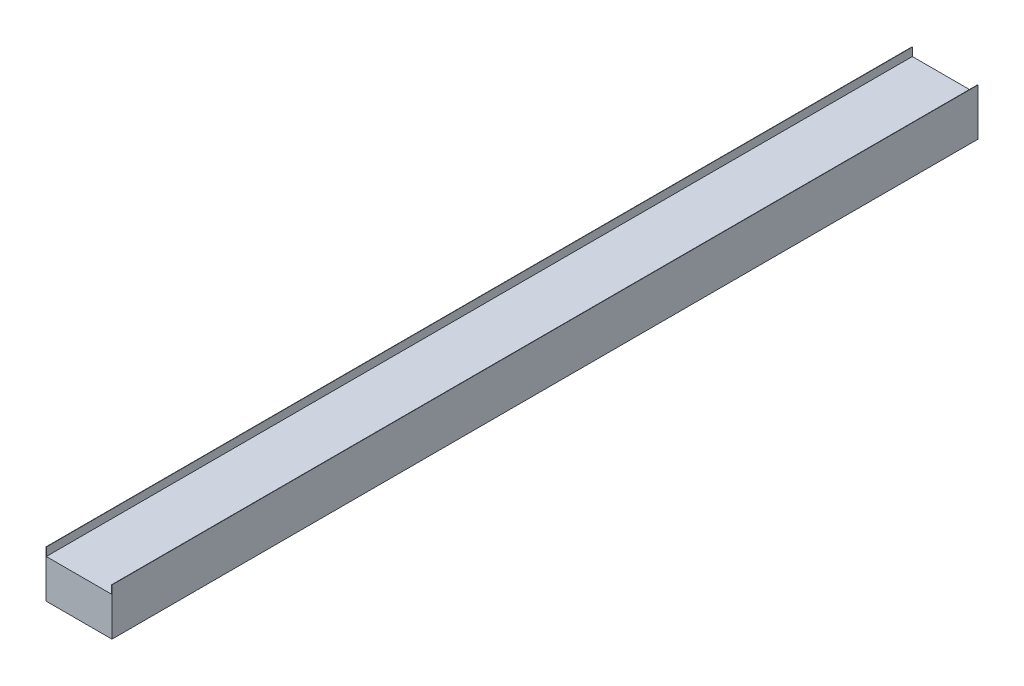
ISO-10303-21;
HEADER;
FILE_DESCRIPTION(('STEP AP214'),'2;1');
FILE_NAME('part.step','',(''),(''),'','','');
FILE_SCHEMA(('AUTOMOTIVE_DESIGN { 1 0 10303 214 1 1 1 1 }'));
ENDSEC;
DATA;
#1=APPLICATION_CONTEXT('core data for automotive mechanical design processes');
#2=APPLICATION_PROTOCOL_DEFINITION('international standard','automotive_design',2000,#1);
#3=PRODUCT_CONTEXT('',#1,'mechanical');
#4=PRODUCT('Part','Part','',(#3));
#5=PRODUCT_RELATED_PRODUCT_CATEGORY('part','',(#4));
#6=PRODUCT_DEFINITION_FORMATION('','',#4);
#7=PRODUCT_DEFINITION_CONTEXT('part definition',#1,'design');
#8=PRODUCT_DEFINITION('design','',#6,#7);
#9=PRODUCT_DEFINITION_SHAPE('','',#8);
#10=(LENGTH_UNIT() NAMED_UNIT(*) SI_UNIT(.MILLI.,.METRE.));
#11=(NAMED_UNIT(*) PLANE_ANGLE_UNIT() SI_UNIT($,.RADIAN.));
#12=(NAMED_UNIT(*) SI_UNIT($,.STERADIAN.) SOLID_ANGLE_UNIT());
#13=UNCERTAINTY_MEASURE_WITH_UNIT(LENGTH_MEASURE(1.E-05),#10,'distance_accuracy_value','');
#14=(GEOMETRIC_REPRESENTATION_CONTEXT(3) GLOBAL_UNCERTAINTY_ASSIGNED_CONTEXT((#13)) GLOBAL_UNIT_ASSIGNED_CONTEXT((#10,
#11,#12)) REPRESENTATION_CONTEXT('',''));
#15=CARTESIAN_POINT('',(0.,0.,0.));
#16=DIRECTION('',(0.,0.,1.));
#17=DIRECTION('',(1.,0.,0.));
#18=AXIS2_PLACEMENT_3D('',#15,#16,#17);
#19=CARTESIAN_POINT('',(0.,0.,10500.));
#20=DIRECTION('',(1.,0.,0.));
#21=DIRECTION('',(0.,1.,0.));
#22=AXIS2_PLACEMENT_3D('',#19,#20,#21);
#23=PLANE('',#22);
#24=DIRECTION('',(0.,-1.,0.));
#25=VECTOR('',#24,1.);
#26=CARTESIAN_POINT('',(0.,0.,0.));
#27=LINE('',#26,#25);
#28=CARTESIAN_POINT('',(0.,0.,0.));
#29=VERTEX_POINT('',#28);
#30=CARTESIAN_POINT('',(0.,-570.,0.));
#31=VERTEX_POINT('',#30);
#32=EDGE_CURVE('E132',#29,#31,#27,.T.);
#33=ORIENTED_EDGE('',*,*,#32,.T.);
#34=DIRECTION('',(0.,0.,-1.));
#35=VECTOR('',#34,1.);
#36=CARTESIAN_POINT('',(0.,-570.,10500.));
#37=LINE('',#36,#35);
#38=CARTESIAN_POINT('',(0.,-570.,10500.));
#39=VERTEX_POINT('',#38);
#40=EDGE_CURVE('E11',#39,#31,#37,.T.);
#41=ORIENTED_EDGE('',*,*,#40,.F.);
#42=DIRECTION('',(0.,-1.,0.));
#43=VECTOR('',#42,1.);
#44=CARTESIAN_POINT('',(0.,0.,10500.));
#45=LINE('',#44,#43);
#46=CARTESIAN_POINT('',(0.,0.,10500.));
#47=VERTEX_POINT('',#46);
#48=EDGE_CURVE('E146',#47,#39,#45,.T.);
#49=ORIENTED_EDGE('',*,*,#48,.F.);
#50=DIRECTION('',(0.,0.,-1.));
#51=VECTOR('',#50,1.);
#52=CARTESIAN_POINT('',(0.,0.,10500.));
#53=LINE('',#52,#51);
#54=EDGE_CURVE('E128',#47,#29,#53,.T.);
#55=ORIENTED_EDGE('',*,*,#54,.T.);
#56=EDGE_LOOP('',(#33,#41,#49,#55));
#57=FACE_BOUND('',#56,.T.);
#58=ADVANCED_FACE('F36',(#57),#23,.F.);
#59=CARTESIAN_POINT('',(0.,-570.,10500.));
#60=DIRECTION('',(0.,1.,0.));
#61=DIRECTION('',(0.,0.,1.));
#62=AXIS2_PLACEMENT_3D('',#59,#60,#61);
#63=PLANE('',#62);
#64=DIRECTION('',(1.,0.,0.));
#65=VECTOR('',#64,1.);
#66=CARTESIAN_POINT('',(0.,-570.,0.));
#67=LINE('',#66,#65);
#68=CARTESIAN_POINT('',(800.,-570.,0.));
#69=VERTEX_POINT('',#68);
#70=EDGE_CURVE('E135',#31,#69,#67,.T.);
#71=ORIENTED_EDGE('',*,*,#70,.T.);
#72=DIRECTION('',(0.,0.,-1.));
#73=VECTOR('',#72,1.);
#74=CARTESIAN_POINT('',(800.,-570.,10500.));
#75=LINE('',#74,#73);
#76=CARTESIAN_POINT('',(800.,-570.,10500.));
#77=VERTEX_POINT('',#76);
#78=EDGE_CURVE('E44',#77,#69,#75,.T.);
#79=ORIENTED_EDGE('',*,*,#78,.F.);
#80=DIRECTION('',(1.,0.,0.));
#81=VECTOR('',#80,1.);
#82=CARTESIAN_POINT('',(0.,-570.,10500.));
#83=LINE('',#82,#81);
#84=EDGE_CURVE('E95',#39,#77,#83,.T.);
#85=ORIENTED_EDGE('',*,*,#84,.F.);
#86=ORIENTED_EDGE('',*,*,#40,.T.);
#87=EDGE_LOOP('',(#71,#79,#85,#86));
#88=FACE_BOUND('',#87,.T.);
#89=ADVANCED_FACE('F181',(#88),#63,.F.);
#90=CARTESIAN_POINT('',(800.,0.,10500.));
#91=DIRECTION('',(-1.,0.,0.));
#92=DIRECTION('',(0.,-1.,0.));
#93=AXIS2_PLACEMENT_3D('',#90,#91,#92);
#94=PLANE('',#93);
#95=DIRECTION('',(0.,1.,0.));
#96=VECTOR('',#95,1.);
#97=CARTESIAN_POINT('',(800.,0.,0.));
#98=LINE('',#97,#96);
#99=CARTESIAN_POINT('',(800.,0.,0.));
#100=VERTEX_POINT('',#99);
#101=EDGE_CURVE('E137',#69,#100,#98,.T.);
#102=ORIENTED_EDGE('',*,*,#101,.T.);
#103=DIRECTION('',(0.,0.,-1.));
#104=VECTOR('',#103,1.);
#105=CARTESIAN_POINT('',(800.,0.,10500.));
#106=LINE('',#105,#104);
#107=CARTESIAN_POINT('',(800.,0.,10500.));
#108=VERTEX_POINT('',#107);
#109=EDGE_CURVE('E153',#108,#100,#106,.T.);
#110=ORIENTED_EDGE('',*,*,#109,.F.);
#111=DIRECTION('',(0.,1.,0.));
#112=VECTOR('',#111,1.);
#113=CARTESIAN_POINT('',(800.,0.,10500.));
#114=LINE('',#113,#112);
#115=EDGE_CURVE('E161',#77,#108,#114,.T.);
#116=ORIENTED_EDGE('',*,*,#115,.F.);
#117=ORIENTED_EDGE('',*,*,#78,.T.);
#118=EDGE_LOOP('',(#102,#110,#116,#117));
#119=FACE_BOUND('',#118,.T.);
#120=ADVANCED_FACE('F159',(#119),#94,.F.);
#121=CARTESIAN_POINT('',(796.,0.,10500.));
#122=DIRECTION('',(0.,-1.,0.));
#123=DIRECTION('',(0.,0.,-1.));
#124=AXIS2_PLACEMENT_3D('',#121,#122,#123);
#125=PLANE('',#124);
#126=DIRECTION('',(-1.,0.,0.));
#127=VECTOR('',#126,1.);
#128=CARTESIAN_POINT('',(796.,0.,0.));
#129=LINE('',#128,#127);
#130=CARTESIAN_POINT('',(796.,0.,0.));
#131=VERTEX_POINT('',#130);
#132=EDGE_CURVE('E139',#100,#131,#129,.T.);
#133=ORIENTED_EDGE('',*,*,#132,.T.);
#134=DIRECTION('',(0.,0.,-1.));
#135=VECTOR('',#134,1.);
#136=CARTESIAN_POINT('',(796.,0.,10500.));
#137=LINE('',#136,#135);
#138=CARTESIAN_POINT('',(796.,0.,10500.));
#139=VERTEX_POINT('',#138);
#140=EDGE_CURVE('E150',#139,#131,#137,.T.);
#141=ORIENTED_EDGE('',*,*,#140,.F.);
#142=DIRECTION('',(-1.,0.,0.));
#143=VECTOR('',#142,1.);
#144=CARTESIAN_POINT('',(796.,0.,10500.));
#145=LINE('',#144,#143);
#146=EDGE_CURVE('E173',#108,#139,#145,.T.);
#147=ORIENTED_EDGE('',*,*,#146,.F.);
#148=ORIENTED_EDGE('',*,*,#109,.T.);
#149=EDGE_LOOP('',(#133,#141,#147,#148));
#150=FACE_BOUND('',#149,.T.);
#151=ADVANCED_FACE('F169',(#150),#125,.F.);
#152=CARTESIAN_POINT('',(796.,-100.,10500.));
#153=DIRECTION('',(1.,0.,0.));
#154=DIRECTION('',(0.,0.,-1.));
#155=AXIS2_PLACEMENT_3D('',#152,#153,#154);
#156=PLANE('',#155);
#157=DIRECTION('',(0.,-1.,0.));
#158=VECTOR('',#157,1.);
#159=CARTESIAN_POINT('',(796.,-100.,0.));
#160=LINE('',#159,#158);
#161=CARTESIAN_POINT('',(796.,-100.,0.));
#162=VERTEX_POINT('',#161);
#163=EDGE_CURVE('E141',#131,#162,#160,.T.);
#164=ORIENTED_EDGE('',*,*,#163,.T.);
#165=DIRECTION('',(0.,0.,-1.));
#166=VECTOR('',#165,1.);
#167=CARTESIAN_POINT('',(796.,-100.,10500.));
#168=LINE('',#167,#166);
#169=CARTESIAN_POINT('',(796.,-100.,10500.));
#170=VERTEX_POINT('',#169);
#171=EDGE_CURVE('E123',#170,#162,#168,.T.);
#172=ORIENTED_EDGE('',*,*,#171,.F.);
#173=DIRECTION('',(0.,-1.,0.));
#174=VECTOR('',#173,1.);
#175=CARTESIAN_POINT('',(796.,-100.,10500.));
#176=LINE('',#175,#174);
#177=EDGE_CURVE('E114',#139,#170,#176,.T.);
#178=ORIENTED_EDGE('',*,*,#177,.F.);
#179=ORIENTED_EDGE('',*,*,#140,.T.);
#180=EDGE_LOOP('',(#164,#172,#178,#179));
#181=FACE_BOUND('',#180,.T.);
#182=ADVANCED_FACE('F172',(#181),#156,.F.);
#183=CARTESIAN_POINT('',(4.00000000000001,-100.,10500.));
#184=DIRECTION('',(0.,-1.,0.));
#185=DIRECTION('',(0.,0.,-1.));
#186=AXIS2_PLACEMENT_3D('',#183,#184,#185);
#187=PLANE('',#186);
#188=DIRECTION('',(-1.,0.,0.));
#189=VECTOR('',#188,1.);
#190=CARTESIAN_POINT('',(4.00000000000001,-100.,0.));
#191=LINE('',#190,#189);
#192=CARTESIAN_POINT('',(4.00000000000001,-100.,0.));
#193=VERTEX_POINT('',#192);
#194=EDGE_CURVE('E122',#162,#193,#191,.T.);
#195=ORIENTED_EDGE('',*,*,#194,.T.);
#196=DIRECTION('',(0.,0.,-1.));
#197=VECTOR('',#196,1.);
#198=CARTESIAN_POINT('',(4.00000000000001,-100.,10500.));
#199=LINE('',#198,#197);
#200=CARTESIAN_POINT('',(4.00000000000001,-100.,10500.));
#201=VERTEX_POINT('',#200);
#202=EDGE_CURVE('E119',#201,#193,#199,.T.);
#203=ORIENTED_EDGE('',*,*,#202,.F.);
#204=DIRECTION('',(-1.,0.,0.));
#205=VECTOR('',#204,1.);
#206=CARTESIAN_POINT('',(4.00000000000001,-100.,10500.));
#207=LINE('',#206,#205);
#208=EDGE_CURVE('E108',#170,#201,#207,.T.);
#209=ORIENTED_EDGE('',*,*,#208,.F.);
#210=ORIENTED_EDGE('',*,*,#171,.T.);
#211=EDGE_LOOP('',(#195,#203,#209,#210));
#212=FACE_BOUND('',#211,.T.);
#213=ADVANCED_FACE('F120',(#212),#187,.F.);
#214=CARTESIAN_POINT('',(4.,0.,10500.));
#215=DIRECTION('',(-1.,0.,0.));
#216=DIRECTION('',(0.,-1.,0.));
#217=AXIS2_PLACEMENT_3D('',#214,#215,#216);
#218=PLANE('',#217);
#219=DIRECTION('',(0.,1.,0.));
#220=VECTOR('',#219,1.);
#221=CARTESIAN_POINT('',(4.,0.,0.));
#222=LINE('',#221,#220);
#223=CARTESIAN_POINT('',(4.,0.,0.));
#224=VERTEX_POINT('',#223);
#225=EDGE_CURVE('E81',#193,#224,#222,.T.);
#226=ORIENTED_EDGE('',*,*,#225,.T.);
#227=DIRECTION('',(0.,0.,-1.));
#228=VECTOR('',#227,1.);
#229=CARTESIAN_POINT('',(4.,0.,10500.));
#230=LINE('',#229,#228);
#231=CARTESIAN_POINT('',(4.,0.,10500.));
#232=VERTEX_POINT('',#231);
#233=EDGE_CURVE('E124',#232,#224,#230,.T.);
#234=ORIENTED_EDGE('',*,*,#233,.F.);
#235=DIRECTION('',(0.,1.,0.));
#236=VECTOR('',#235,1.);
#237=CARTESIAN_POINT('',(4.,0.,10500.));
#238=LINE('',#237,#236);
#239=EDGE_CURVE('E112',#201,#232,#238,.T.);
#240=ORIENTED_EDGE('',*,*,#239,.F.);
#241=ORIENTED_EDGE('',*,*,#202,.T.);
#242=EDGE_LOOP('',(#226,#234,#240,#241));
#243=FACE_BOUND('',#242,.T.);
#244=ADVANCED_FACE('F126',(#243),#218,.F.);
#245=CARTESIAN_POINT('',(0.,0.,10500.));
#246=DIRECTION('',(0.,-1.,0.));
#247=DIRECTION('',(1.,0.,0.));
#248=AXIS2_PLACEMENT_3D('',#245,#246,#247);
#249=PLANE('',#248);
#250=DIRECTION('',(-1.,0.,0.));
#251=VECTOR('',#250,1.);
#252=CARTESIAN_POINT('',(0.,0.,0.));
#253=LINE('',#252,#251);
#254=EDGE_CURVE('E87',#224,#29,#253,.T.);
#255=ORIENTED_EDGE('',*,*,#254,.T.);
#256=ORIENTED_EDGE('',*,*,#54,.F.);
#257=DIRECTION('',(-1.,0.,0.));
#258=VECTOR('',#257,1.);
#259=CARTESIAN_POINT('',(0.,0.,10500.));
#260=LINE('',#259,#258);
#261=EDGE_CURVE('E52',#232,#47,#260,.T.);
#262=ORIENTED_EDGE('',*,*,#261,.F.);
#263=ORIENTED_EDGE('',*,*,#233,.T.);
#264=EDGE_LOOP('',(#255,#256,#262,#263));
#265=FACE_BOUND('',#264,.T.);
#266=ADVANCED_FACE('F197',(#265),#249,.F.);
#267=CARTESIAN_POINT('',(0.,0.,10500.));
#268=DIRECTION('',(0.,0.,1.));
#269=DIRECTION('',(1.,0.,0.));
#270=AXIS2_PLACEMENT_3D('',#267,#268,#269);
#271=PLANE('',#270);
#272=ORIENTED_EDGE('',*,*,#48,.T.);
#273=ORIENTED_EDGE('',*,*,#84,.T.);
#274=ORIENTED_EDGE('',*,*,#115,.T.);
#275=ORIENTED_EDGE('',*,*,#146,.T.);
#276=ORIENTED_EDGE('',*,*,#177,.T.);
#277=ORIENTED_EDGE('',*,*,#208,.T.);
#278=ORIENTED_EDGE('',*,*,#239,.T.);
#279=ORIENTED_EDGE('',*,*,#261,.T.);
#280=EDGE_LOOP('',(#272,#273,#274,#275,#276,#277,#278,#279));
#281=FACE_BOUND('',#280,.T.);
#282=ADVANCED_FACE('F110',(#281),#271,.T.);
#283=CARTESIAN_POINT('',(0.,0.,0.));
#284=DIRECTION('',(0.,0.,1.));
#285=DIRECTION('',(1.,0.,0.));
#286=AXIS2_PLACEMENT_3D('',#283,#284,#285);
#287=PLANE('',#286);
#288=ORIENTED_EDGE('',*,*,#32,.F.);
#289=ORIENTED_EDGE('',*,*,#254,.F.);
#290=ORIENTED_EDGE('',*,*,#225,.F.);
#291=ORIENTED_EDGE('',*,*,#194,.F.);
#292=ORIENTED_EDGE('',*,*,#163,.F.);
#293=ORIENTED_EDGE('',*,*,#132,.F.);
#294=ORIENTED_EDGE('',*,*,#101,.F.);
#295=ORIENTED_EDGE('',*,*,#70,.F.);
#296=EDGE_LOOP('',(#288,#289,#290,#291,#292,#293,#294,#295));
#297=FACE_BOUND('',#296,.T.);
#298=ADVANCED_FACE('F165',(#297),#287,.F.);
#299=CLOSED_SHELL('',(#58,#89,#120,#151,#182,#213,#244,#266,#282,#298));
#300=MANIFOLD_SOLID_BREP('B2',#299);
#301=ADVANCED_BREP_SHAPE_REPRESENTATION('',(#18,#300),#14);
#302=SHAPE_DEFINITION_REPRESENTATION(#9,#301);
ENDSEC;
END-ISO-10303-21;
